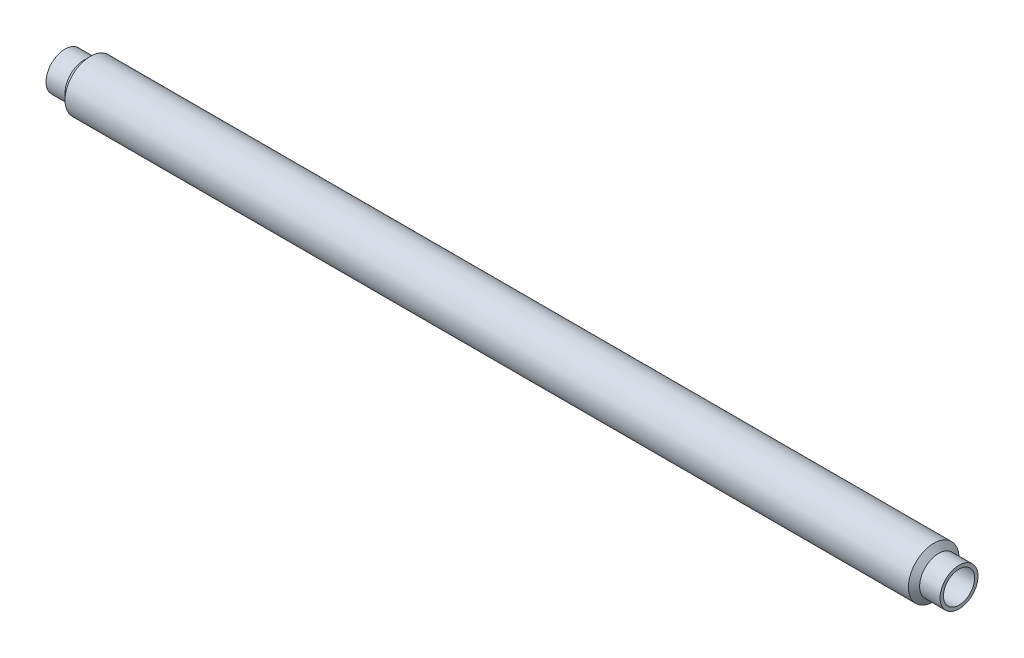
ISO-10303-21;
HEADER;
FILE_DESCRIPTION(('STEP AP214'),'2;1');
FILE_NAME('part.step','',(''),(''),'','','');
FILE_SCHEMA(('AUTOMOTIVE_DESIGN { 1 0 10303 214 1 1 1 1 }'));
ENDSEC;
DATA;
#1=APPLICATION_CONTEXT('core data for automotive mechanical design processes');
#2=APPLICATION_PROTOCOL_DEFINITION('international standard','automotive_design',2000,#1);
#3=PRODUCT_CONTEXT('',#1,'mechanical');
#4=PRODUCT('Part','Part','',(#3));
#5=PRODUCT_RELATED_PRODUCT_CATEGORY('part','',(#4));
#6=PRODUCT_DEFINITION_FORMATION('','',#4);
#7=PRODUCT_DEFINITION_CONTEXT('part definition',#1,'design');
#8=PRODUCT_DEFINITION('design','',#6,#7);
#9=PRODUCT_DEFINITION_SHAPE('','',#8);
#10=(LENGTH_UNIT() NAMED_UNIT(*) SI_UNIT(.MILLI.,.METRE.));
#11=(NAMED_UNIT(*) PLANE_ANGLE_UNIT() SI_UNIT($,.RADIAN.));
#12=(NAMED_UNIT(*) SI_UNIT($,.STERADIAN.) SOLID_ANGLE_UNIT());
#13=UNCERTAINTY_MEASURE_WITH_UNIT(LENGTH_MEASURE(1.E-05),#10,'distance_accuracy_value','');
#14=(GEOMETRIC_REPRESENTATION_CONTEXT(3) GLOBAL_UNCERTAINTY_ASSIGNED_CONTEXT((#13)) GLOBAL_UNIT_ASSIGNED_CONTEXT((#10,
#11,#12)) REPRESENTATION_CONTEXT('',''));
#15=CARTESIAN_POINT('',(0.,0.,0.));
#16=DIRECTION('',(0.,0.,1.));
#17=DIRECTION('',(1.,0.,0.));
#18=AXIS2_PLACEMENT_3D('',#15,#16,#17);
#19=CARTESIAN_POINT('',(0.,0.,0.));
#20=DIRECTION('',(1.,0.,0.));
#21=DIRECTION('',(0.,0.,-1.));
#22=AXIS2_PLACEMENT_3D('',#19,#20,#21);
#23=PLANE('',#22);
#24=CARTESIAN_POINT('',(0.,0.,0.));
#25=DIRECTION('',(1.,0.,0.));
#26=DIRECTION('',(0.,0.,-1.));
#27=AXIS2_PLACEMENT_3D('',#24,#25,#26);
#28=CIRCLE('',#27,62.5);
#29=CARTESIAN_POINT('',(0.,0.,-62.5));
#30=VERTEX_POINT('',#29);
#31=EDGE_CURVE('E59',#30,#30,#28,.T.);
#32=ORIENTED_EDGE('',*,*,#31,.T.);
#33=EDGE_LOOP('',(#32));
#34=FACE_BOUND('',#33,.T.);
#35=CARTESIAN_POINT('',(0.,0.,0.));
#36=DIRECTION('',(-1.,0.,0.));
#37=DIRECTION('',(0.,0.,1.));
#38=AXIS2_PLACEMENT_3D('',#35,#36,#37);
#39=CIRCLE('',#38,87.5);
#40=CARTESIAN_POINT('',(0.,0.,87.5));
#41=VERTEX_POINT('',#40);
#42=EDGE_CURVE('E90',#41,#41,#39,.T.);
#43=ORIENTED_EDGE('',*,*,#42,.T.);
#44=EDGE_LOOP('',(#43));
#45=FACE_BOUND('',#44,.T.);
#46=ADVANCED_FACE('F41',(#34,#45),#23,.F.);
#47=CARTESIAN_POINT('',(5000.,0.,0.));
#48=DIRECTION('',(1.,0.,0.));
#49=DIRECTION('',(0.,0.,-1.));
#50=AXIS2_PLACEMENT_3D('',#47,#48,#49);
#51=PLANE('',#50);
#52=CARTESIAN_POINT('',(5000.,0.,0.));
#53=DIRECTION('',(1.,0.,0.));
#54=DIRECTION('',(0.,0.,-1.));
#55=AXIS2_PLACEMENT_3D('',#52,#53,#54);
#56=CIRCLE('',#55,62.5);
#57=CARTESIAN_POINT('',(5000.,0.,-62.5));
#58=VERTEX_POINT('',#57);
#59=EDGE_CURVE('E54',#58,#58,#56,.T.);
#60=ORIENTED_EDGE('',*,*,#59,.F.);
#61=EDGE_LOOP('',(#60));
#62=FACE_BOUND('',#61,.T.);
#63=CARTESIAN_POINT('',(5000.,0.,0.));
#64=DIRECTION('',(1.,0.,0.));
#65=DIRECTION('',(0.,0.,-1.));
#66=AXIS2_PLACEMENT_3D('',#63,#64,#65);
#67=CIRCLE('',#66,92.5);
#68=CARTESIAN_POINT('',(5000.,0.,-92.5));
#69=VERTEX_POINT('',#68);
#70=EDGE_CURVE('E10',#69,#69,#67,.F.);
#71=ORIENTED_EDGE('',*,*,#70,.F.);
#72=EDGE_LOOP('',(#71));
#73=FACE_BOUND('',#72,.T.);
#74=ADVANCED_FACE('F118',(#62,#73),#51,.T.);
#75=CARTESIAN_POINT('',(5000.,0.,0.));
#76=DIRECTION('',(-1.,0.,0.));
#77=DIRECTION('',(0.,0.,1.));
#78=AXIS2_PLACEMENT_3D('',#75,#76,#77);
#79=CYLINDRICAL_SURFACE('',#78,150.);
#80=CARTESIAN_POINT('',(5000.,0.,0.));
#81=DIRECTION('',(1.,0.,0.));
#82=DIRECTION('',(0.,0.,-1.));
#83=AXIS2_PLACEMENT_3D('',#80,#81,#82);
#84=CIRCLE('',#83,150.);
#85=CARTESIAN_POINT('',(5000.,0.,-150.));
#86=VERTEX_POINT('',#85);
#87=EDGE_CURVE('E49',#86,#86,#84,.T.);
#88=ORIENTED_EDGE('',*,*,#87,.F.);
#89=EDGE_LOOP('',(#88));
#90=FACE_BOUND('',#89,.T.);
#91=CARTESIAN_POINT('',(0.,0.,0.));
#92=DIRECTION('',(1.,0.,0.));
#93=DIRECTION('',(0.,0.,-1.));
#94=AXIS2_PLACEMENT_3D('',#91,#92,#93);
#95=CIRCLE('',#94,150.);
#96=CARTESIAN_POINT('',(0.,0.,-150.));
#97=VERTEX_POINT('',#96);
#98=EDGE_CURVE('E77',#97,#97,#95,.T.);
#99=ORIENTED_EDGE('',*,*,#98,.T.);
#100=EDGE_LOOP('',(#99));
#101=FACE_BOUND('',#100,.T.);
#102=ADVANCED_FACE('F43',(#90,#101),#79,.T.);
#103=CARTESIAN_POINT('',(5000.,0.,0.));
#104=DIRECTION('',(-1.,0.,0.));
#105=DIRECTION('',(0.,0.,1.));
#106=AXIS2_PLACEMENT_3D('',#103,#104,#105);
#107=CYLINDRICAL_SURFACE('',#106,62.5);
#108=ORIENTED_EDGE('',*,*,#59,.T.);
#109=EDGE_LOOP('',(#108));
#110=FACE_BOUND('',#109,.T.);
#111=ORIENTED_EDGE('',*,*,#31,.F.);
#112=EDGE_LOOP('',(#111));
#113=FACE_BOUND('',#112,.T.);
#114=ADVANCED_FACE('F127',(#110,#113),#107,.F.);
#115=CARTESIAN_POINT('',(5028.95018341335,0.,0.));
#116=DIRECTION('',(-1.,0.,0.));
#117=DIRECTION('',(0.,0.,1.));
#118=AXIS2_PLACEMENT_3D('',#115,#116,#117);
#119=CONICAL_SURFACE('',#118,112.5,0.913360185990278);
#120=ORIENTED_EDGE('',*,*,#87,.T.);
#121=EDGE_LOOP('',(#120));
#122=FACE_BOUND('',#121,.T.);
#123=CARTESIAN_POINT('',(5028.95018341335,0.,0.));
#124=DIRECTION('',(1.,0.,0.));
#125=DIRECTION('',(0.,0.,-1.));
#126=AXIS2_PLACEMENT_3D('',#123,#124,#125);
#127=CIRCLE('',#126,112.5);
#128=CARTESIAN_POINT('',(5028.95018341335,0.,-112.5));
#129=VERTEX_POINT('',#128);
#130=EDGE_CURVE('E64',#129,#129,#127,.T.);
#131=ORIENTED_EDGE('',*,*,#130,.F.);
#132=EDGE_LOOP('',(#131));
#133=FACE_BOUND('',#132,.T.);
#134=ADVANCED_FACE('F130',(#122,#133),#119,.T.);
#135=CARTESIAN_POINT('',(5150.,0.,0.));
#136=DIRECTION('',(1.,0.,0.));
#137=DIRECTION('',(0.,0.,-1.));
#138=AXIS2_PLACEMENT_3D('',#135,#136,#137);
#139=PLANE('',#138);
#140=CARTESIAN_POINT('',(5150.,0.,0.));
#141=DIRECTION('',(1.,0.,0.));
#142=DIRECTION('',(0.,0.,-1.));
#143=AXIS2_PLACEMENT_3D('',#140,#141,#142);
#144=CIRCLE('',#143,112.5);
#145=CARTESIAN_POINT('',(5150.,0.,-112.5));
#146=VERTEX_POINT('',#145);
#147=EDGE_CURVE('E69',#146,#146,#144,.T.);
#148=ORIENTED_EDGE('',*,*,#147,.T.);
#149=EDGE_LOOP('',(#148));
#150=FACE_BOUND('',#149,.T.);
#151=CARTESIAN_POINT('',(5150.,0.,0.));
#152=DIRECTION('',(1.,0.,0.));
#153=DIRECTION('',(0.,0.,-1.));
#154=AXIS2_PLACEMENT_3D('',#151,#152,#153);
#155=CIRCLE('',#154,92.5);
#156=CARTESIAN_POINT('',(5150.,0.,-92.5));
#157=VERTEX_POINT('',#156);
#158=EDGE_CURVE('E73',#157,#157,#155,.T.);
#159=ORIENTED_EDGE('',*,*,#158,.F.);
#160=EDGE_LOOP('',(#159));
#161=FACE_BOUND('',#160,.T.);
#162=ADVANCED_FACE('F134',(#150,#161),#139,.T.);
#163=CARTESIAN_POINT('',(5150.,0.,0.));
#164=DIRECTION('',(-1.,0.,0.));
#165=DIRECTION('',(0.,0.,1.));
#166=AXIS2_PLACEMENT_3D('',#163,#164,#165);
#167=CYLINDRICAL_SURFACE('',#166,112.5);
#168=ORIENTED_EDGE('',*,*,#130,.T.);
#169=EDGE_LOOP('',(#168));
#170=FACE_BOUND('',#169,.T.);
#171=ORIENTED_EDGE('',*,*,#147,.F.);
#172=EDGE_LOOP('',(#171));
#173=FACE_BOUND('',#172,.T.);
#174=ADVANCED_FACE('F135',(#170,#173),#167,.T.);
#175=CARTESIAN_POINT('',(5150.,0.,0.));
#176=DIRECTION('',(-1.,0.,0.));
#177=DIRECTION('',(0.,0.,1.));
#178=AXIS2_PLACEMENT_3D('',#175,#176,#177);
#179=CYLINDRICAL_SURFACE('',#178,92.5);
#180=ORIENTED_EDGE('',*,*,#158,.T.);
#181=EDGE_LOOP('',(#180));
#182=FACE_BOUND('',#181,.T.);
#183=ORIENTED_EDGE('',*,*,#70,.T.);
#184=EDGE_LOOP('',(#183));
#185=FACE_BOUND('',#184,.T.);
#186=ADVANCED_FACE('F113',(#182,#185),#179,.F.);
#187=CARTESIAN_POINT('',(0.,0.,0.));
#188=DIRECTION('',(1.,0.,0.));
#189=DIRECTION('',(0.,0.,-1.));
#190=AXIS2_PLACEMENT_3D('',#187,#188,#189);
#191=CONICAL_SURFACE('',#190,150.,0.790496481556196);
#192=CARTESIAN_POINT('',(-37.1195624336225,0.,0.));
#193=DIRECTION('',(1.,0.,0.));
#194=DIRECTION('',(0.,0.,-1.));
#195=AXIS2_PLACEMENT_3D('',#192,#193,#194);
#196=CIRCLE('',#195,112.5);
#197=CARTESIAN_POINT('',(-37.1195624336225,0.,-112.5));
#198=VERTEX_POINT('',#197);
#199=EDGE_CURVE('E81',#198,#198,#196,.T.);
#200=ORIENTED_EDGE('',*,*,#199,.T.);
#201=EDGE_LOOP('',(#200));
#202=FACE_BOUND('',#201,.T.);
#203=ORIENTED_EDGE('',*,*,#98,.F.);
#204=EDGE_LOOP('',(#203));
#205=FACE_BOUND('',#204,.T.);
#206=ADVANCED_FACE('F104',(#202,#205),#191,.T.);
#207=CARTESIAN_POINT('',(-150.,0.,0.));
#208=DIRECTION('',(-1.,0.,0.));
#209=DIRECTION('',(0.,0.,1.));
#210=AXIS2_PLACEMENT_3D('',#207,#208,#209);
#211=PLANE('',#210);
#212=CARTESIAN_POINT('',(-150.,0.,0.));
#213=DIRECTION('',(-1.,0.,0.));
#214=DIRECTION('',(0.,0.,1.));
#215=AXIS2_PLACEMENT_3D('',#212,#213,#214);
#216=CIRCLE('',#215,112.5);
#217=CARTESIAN_POINT('',(-150.,0.,112.5));
#218=VERTEX_POINT('',#217);
#219=EDGE_CURVE('E85',#218,#218,#216,.T.);
#220=ORIENTED_EDGE('',*,*,#219,.T.);
#221=EDGE_LOOP('',(#220));
#222=FACE_BOUND('',#221,.T.);
#223=CARTESIAN_POINT('',(-150.,0.,0.));
#224=DIRECTION('',(-1.,0.,0.));
#225=DIRECTION('',(0.,0.,1.));
#226=AXIS2_PLACEMENT_3D('',#223,#224,#225);
#227=CIRCLE('',#226,87.5);
#228=CARTESIAN_POINT('',(-150.,0.,87.5));
#229=VERTEX_POINT('',#228);
#230=EDGE_CURVE('E89',#229,#229,#227,.T.);
#231=ORIENTED_EDGE('',*,*,#230,.F.);
#232=EDGE_LOOP('',(#231));
#233=FACE_BOUND('',#232,.T.);
#234=ADVANCED_FACE('F101',(#222,#233),#211,.T.);
#235=CARTESIAN_POINT('',(-150.,0.,0.));
#236=DIRECTION('',(1.,0.,0.));
#237=DIRECTION('',(0.,0.,-1.));
#238=AXIS2_PLACEMENT_3D('',#235,#236,#237);
#239=CYLINDRICAL_SURFACE('',#238,112.5);
#240=ORIENTED_EDGE('',*,*,#199,.F.);
#241=EDGE_LOOP('',(#240));
#242=FACE_BOUND('',#241,.T.);
#243=ORIENTED_EDGE('',*,*,#219,.F.);
#244=EDGE_LOOP('',(#243));
#245=FACE_BOUND('',#244,.T.);
#246=ADVANCED_FACE('F103',(#242,#245),#239,.T.);
#247=CARTESIAN_POINT('',(-150.,0.,0.));
#248=DIRECTION('',(1.,0.,0.));
#249=DIRECTION('',(0.,0.,-1.));
#250=AXIS2_PLACEMENT_3D('',#247,#248,#249);
#251=CYLINDRICAL_SURFACE('',#250,87.5);
#252=ORIENTED_EDGE('',*,*,#230,.T.);
#253=EDGE_LOOP('',(#252));
#254=FACE_BOUND('',#253,.T.);
#255=ORIENTED_EDGE('',*,*,#42,.F.);
#256=EDGE_LOOP('',(#255));
#257=FACE_BOUND('',#256,.T.);
#258=ADVANCED_FACE('F98',(#254,#257),#251,.F.);
#259=CLOSED_SHELL('',(#46,#74,#102,#114,#134,#162,#174,#186,#206,#234,#246,#258));
#260=MANIFOLD_SOLID_BREP('B2',#259);
#261=ADVANCED_BREP_SHAPE_REPRESENTATION('',(#18,#260),#14);
#262=SHAPE_DEFINITION_REPRESENTATION(#9,#261);
ENDSEC;
END-ISO-10303-21;
